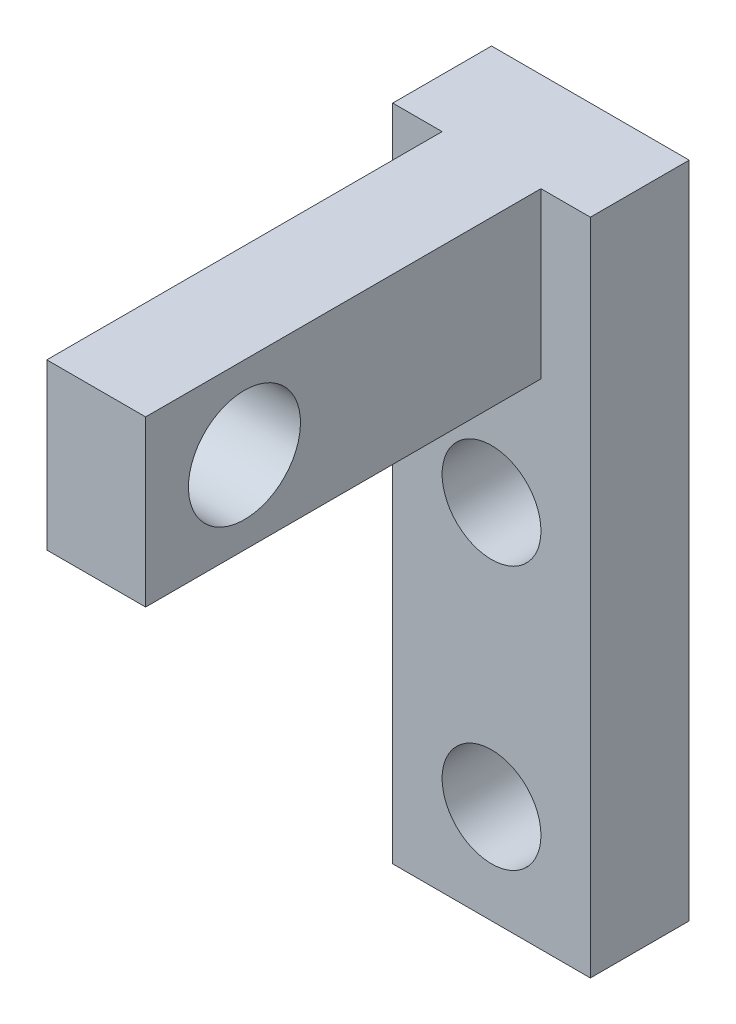
ISO-10303-21;
HEADER;
FILE_DESCRIPTION(('STEP AP214'),'2;1');
FILE_NAME('part.step','',(''),(''),'','','');
FILE_SCHEMA(('AUTOMOTIVE_DESIGN { 1 0 10303 214 1 1 1 1 }'));
ENDSEC;
DATA;
#1=APPLICATION_CONTEXT('core data for automotive mechanical design processes');
#2=APPLICATION_PROTOCOL_DEFINITION('international standard','automotive_design',2000,#1);
#3=PRODUCT_CONTEXT('',#1,'mechanical');
#4=PRODUCT('Part','Part','',(#3));
#5=PRODUCT_RELATED_PRODUCT_CATEGORY('part','',(#4));
#6=PRODUCT_DEFINITION_FORMATION('','',#4);
#7=PRODUCT_DEFINITION_CONTEXT('part definition',#1,'design');
#8=PRODUCT_DEFINITION('design','',#6,#7);
#9=PRODUCT_DEFINITION_SHAPE('','',#8);
#10=(LENGTH_UNIT() NAMED_UNIT(*) SI_UNIT(.MILLI.,.METRE.));
#11=(NAMED_UNIT(*) PLANE_ANGLE_UNIT() SI_UNIT($,.RADIAN.));
#12=(NAMED_UNIT(*) SI_UNIT($,.STERADIAN.) SOLID_ANGLE_UNIT());
#13=UNCERTAINTY_MEASURE_WITH_UNIT(LENGTH_MEASURE(1.E-05),#10,'distance_accuracy_value','');
#14=(GEOMETRIC_REPRESENTATION_CONTEXT(3) GLOBAL_UNCERTAINTY_ASSIGNED_CONTEXT((#13)) GLOBAL_UNIT_ASSIGNED_CONTEXT((#10,
#11,#12)) REPRESENTATION_CONTEXT('',''));
#15=CARTESIAN_POINT('',(0.,0.,0.));
#16=DIRECTION('',(0.,0.,1.));
#17=DIRECTION('',(1.,0.,0.));
#18=AXIS2_PLACEMENT_3D('',#15,#16,#17);
#19=CARTESIAN_POINT('',(0.,0.,3.));
#20=DIRECTION('',(0.,0.,-1.));
#21=DIRECTION('',(-1.,0.,0.));
#22=AXIS2_PLACEMENT_3D('',#19,#20,#21);
#23=PLANE('',#22);
#24=CARTESIAN_POINT('',(0.,-8.,3.));
#25=DIRECTION('',(0.,0.,1.));
#26=DIRECTION('',(1.,0.,0.));
#27=AXIS2_PLACEMENT_3D('',#24,#25,#26);
#28=CIRCLE('',#27,1.5);
#29=CARTESIAN_POINT('',(1.5,-8.,3.));
#30=VERTEX_POINT('',#29);
#31=EDGE_CURVE('E126',#30,#30,#28,.T.);
#32=ORIENTED_EDGE('',*,*,#31,.F.);
#33=EDGE_LOOP('',(#32));
#34=FACE_BOUND('',#33,.T.);
#35=CARTESIAN_POINT('',(0.,0.,3.));
#36=DIRECTION('',(0.,0.,1.));
#37=DIRECTION('',(1.,0.,0.));
#38=AXIS2_PLACEMENT_3D('',#35,#36,#37);
#39=CIRCLE('',#38,1.5);
#40=CARTESIAN_POINT('',(1.5,0.,3.));
#41=VERTEX_POINT('',#40);
#42=EDGE_CURVE('E135',#41,#41,#39,.T.);
#43=ORIENTED_EDGE('',*,*,#42,.F.);
#44=EDGE_LOOP('',(#43));
#45=FACE_BOUND('',#44,.T.);
#46=DIRECTION('',(0.,1.,0.));
#47=VECTOR('',#46,1.);
#48=CARTESIAN_POINT('',(1.5,9.,3.));
#49=LINE('',#48,#47);
#50=CARTESIAN_POINT('',(1.5,4.,3.));
#51=VERTEX_POINT('',#50);
#52=CARTESIAN_POINT('',(1.5,9.,3.));
#53=VERTEX_POINT('',#52);
#54=EDGE_CURVE('E51',#51,#53,#49,.T.);
#55=ORIENTED_EDGE('',*,*,#54,.F.);
#56=DIRECTION('',(1.,0.,0.));
#57=VECTOR('',#56,1.);
#58=CARTESIAN_POINT('',(1.5,4.,3.));
#59=LINE('',#58,#57);
#60=CARTESIAN_POINT('',(-1.5,4.,3.));
#61=VERTEX_POINT('',#60);
#62=EDGE_CURVE('E120',#61,#51,#59,.T.);
#63=ORIENTED_EDGE('',*,*,#62,.F.);
#64=DIRECTION('',(0.,-1.,0.));
#65=VECTOR('',#64,1.);
#66=CARTESIAN_POINT('',(-1.5,9.,3.));
#67=LINE('',#66,#65);
#68=CARTESIAN_POINT('',(-1.5,9.,3.));
#69=VERTEX_POINT('',#68);
#70=EDGE_CURVE('E57',#69,#61,#67,.T.);
#71=ORIENTED_EDGE('',*,*,#70,.F.);
#72=DIRECTION('',(-1.,0.,0.));
#73=VECTOR('',#72,1.);
#74=CARTESIAN_POINT('',(-3.,9.,3.));
#75=LINE('',#74,#73);
#76=CARTESIAN_POINT('',(-3.,9.,3.));
#77=VERTEX_POINT('',#76);
#78=EDGE_CURVE('E149',#69,#77,#75,.T.);
#79=ORIENTED_EDGE('',*,*,#78,.T.);
#80=DIRECTION('',(0.,-1.,0.));
#81=VECTOR('',#80,1.);
#82=CARTESIAN_POINT('',(-3.,-11.,3.));
#83=LINE('',#82,#81);
#84=CARTESIAN_POINT('',(-3.,-11.,3.));
#85=VERTEX_POINT('',#84);
#86=EDGE_CURVE('E141',#77,#85,#83,.T.);
#87=ORIENTED_EDGE('',*,*,#86,.T.);
#88=DIRECTION('',(1.,0.,0.));
#89=VECTOR('',#88,1.);
#90=CARTESIAN_POINT('',(-3.,-11.,3.));
#91=LINE('',#90,#89);
#92=CARTESIAN_POINT('',(3.,-11.,3.));
#93=VERTEX_POINT('',#92);
#94=EDGE_CURVE('E144',#85,#93,#91,.T.);
#95=ORIENTED_EDGE('',*,*,#94,.T.);
#96=DIRECTION('',(0.,1.,0.));
#97=VECTOR('',#96,1.);
#98=CARTESIAN_POINT('',(3.,-11.,3.));
#99=LINE('',#98,#97);
#100=CARTESIAN_POINT('',(3.,9.,3.));
#101=VERTEX_POINT('',#100);
#102=EDGE_CURVE('E147',#93,#101,#99,.T.);
#103=ORIENTED_EDGE('',*,*,#102,.T.);
#104=EDGE_CURVE('E150',#101,#53,#75,.T.);
#105=ORIENTED_EDGE('',*,*,#104,.T.);
#106=EDGE_LOOP('',(#55,#63,#71,#79,#87,#95,#103,#105));
#107=FACE_BOUND('',#106,.T.);
#108=ADVANCED_FACE('F35',(#34,#45,#107),#23,.F.);
#109=CARTESIAN_POINT('',(0.,0.,0.));
#110=DIRECTION('',(0.,0.,-1.));
#111=DIRECTION('',(-1.,0.,0.));
#112=AXIS2_PLACEMENT_3D('',#109,#110,#111);
#113=PLANE('',#112);
#114=CARTESIAN_POINT('',(0.,0.,0.));
#115=DIRECTION('',(0.,0.,1.));
#116=DIRECTION('',(1.,0.,0.));
#117=AXIS2_PLACEMENT_3D('',#114,#115,#116);
#118=CIRCLE('',#117,1.5);
#119=CARTESIAN_POINT('',(1.5,0.,0.));
#120=VERTEX_POINT('',#119);
#121=EDGE_CURVE('E133',#120,#120,#118,.T.);
#122=ORIENTED_EDGE('',*,*,#121,.T.);
#123=EDGE_LOOP('',(#122));
#124=FACE_BOUND('',#123,.T.);
#125=DIRECTION('',(0.,-1.,0.));
#126=VECTOR('',#125,1.);
#127=CARTESIAN_POINT('',(-3.,-11.,0.));
#128=LINE('',#127,#126);
#129=CARTESIAN_POINT('',(-3.,9.,0.));
#130=VERTEX_POINT('',#129);
#131=CARTESIAN_POINT('',(-3.,-11.,0.));
#132=VERTEX_POINT('',#131);
#133=EDGE_CURVE('E138',#130,#132,#128,.T.);
#134=ORIENTED_EDGE('',*,*,#133,.F.);
#135=DIRECTION('',(-1.,0.,0.));
#136=VECTOR('',#135,1.);
#137=CARTESIAN_POINT('',(-3.,9.,0.));
#138=LINE('',#137,#136);
#139=CARTESIAN_POINT('',(3.,9.,0.));
#140=VERTEX_POINT('',#139);
#141=EDGE_CURVE('E145',#140,#130,#138,.T.);
#142=ORIENTED_EDGE('',*,*,#141,.F.);
#143=DIRECTION('',(0.,1.,0.));
#144=VECTOR('',#143,1.);
#145=CARTESIAN_POINT('',(3.,-11.,0.));
#146=LINE('',#145,#144);
#147=CARTESIAN_POINT('',(3.,-11.,0.));
#148=VERTEX_POINT('',#147);
#149=EDGE_CURVE('E157',#148,#140,#146,.T.);
#150=ORIENTED_EDGE('',*,*,#149,.F.);
#151=DIRECTION('',(1.,0.,0.));
#152=VECTOR('',#151,1.);
#153=CARTESIAN_POINT('',(-3.,-11.,0.));
#154=LINE('',#153,#152);
#155=EDGE_CURVE('E155',#132,#148,#154,.T.);
#156=ORIENTED_EDGE('',*,*,#155,.F.);
#157=EDGE_LOOP('',(#134,#142,#150,#156));
#158=FACE_BOUND('',#157,.T.);
#159=CARTESIAN_POINT('',(0.,-8.,0.));
#160=DIRECTION('',(0.,0.,1.));
#161=DIRECTION('',(1.,0.,0.));
#162=AXIS2_PLACEMENT_3D('',#159,#160,#161);
#163=CIRCLE('',#162,1.5);
#164=CARTESIAN_POINT('',(1.5,-8.,0.));
#165=VERTEX_POINT('',#164);
#166=EDGE_CURVE('E123',#165,#165,#163,.T.);
#167=ORIENTED_EDGE('',*,*,#166,.T.);
#168=EDGE_LOOP('',(#167));
#169=FACE_BOUND('',#168,.T.);
#170=ADVANCED_FACE('F176',(#124,#158,#169),#113,.T.);
#171=CARTESIAN_POINT('',(-3.,-11.,3.));
#172=DIRECTION('',(1.,0.,0.));
#173=DIRECTION('',(0.,0.,-1.));
#174=AXIS2_PLACEMENT_3D('',#171,#172,#173);
#175=PLANE('',#174);
#176=ORIENTED_EDGE('',*,*,#133,.T.);
#177=DIRECTION('',(0.,0.,-1.));
#178=VECTOR('',#177,1.);
#179=CARTESIAN_POINT('',(-3.,-11.,3.));
#180=LINE('',#179,#178);
#181=EDGE_CURVE('E11',#85,#132,#180,.T.);
#182=ORIENTED_EDGE('',*,*,#181,.F.);
#183=ORIENTED_EDGE('',*,*,#86,.F.);
#184=DIRECTION('',(0.,0.,-1.));
#185=VECTOR('',#184,1.);
#186=CARTESIAN_POINT('',(-3.,9.,3.));
#187=LINE('',#186,#185);
#188=EDGE_CURVE('E152',#77,#130,#187,.T.);
#189=ORIENTED_EDGE('',*,*,#188,.T.);
#190=EDGE_LOOP('',(#176,#182,#183,#189));
#191=FACE_BOUND('',#190,.T.);
#192=ADVANCED_FACE('F37',(#191),#175,.F.);
#193=CARTESIAN_POINT('',(-3.,-11.,3.));
#194=DIRECTION('',(0.,1.,0.));
#195=DIRECTION('',(0.,0.,1.));
#196=AXIS2_PLACEMENT_3D('',#193,#194,#195);
#197=PLANE('',#196);
#198=ORIENTED_EDGE('',*,*,#155,.T.);
#199=DIRECTION('',(0.,0.,-1.));
#200=VECTOR('',#199,1.);
#201=CARTESIAN_POINT('',(3.,-11.,3.));
#202=LINE('',#201,#200);
#203=EDGE_CURVE('E44',#93,#148,#202,.T.);
#204=ORIENTED_EDGE('',*,*,#203,.F.);
#205=ORIENTED_EDGE('',*,*,#94,.F.);
#206=ORIENTED_EDGE('',*,*,#181,.T.);
#207=EDGE_LOOP('',(#198,#204,#205,#206));
#208=FACE_BOUND('',#207,.T.);
#209=ADVANCED_FACE('F222',(#208),#197,.F.);
#210=CARTESIAN_POINT('',(3.,-11.,3.));
#211=DIRECTION('',(-1.,0.,0.));
#212=DIRECTION('',(0.,0.,1.));
#213=AXIS2_PLACEMENT_3D('',#210,#211,#212);
#214=PLANE('',#213);
#215=ORIENTED_EDGE('',*,*,#149,.T.);
#216=DIRECTION('',(0.,0.,-1.));
#217=VECTOR('',#216,1.);
#218=CARTESIAN_POINT('',(3.,9.,3.));
#219=LINE('',#218,#217);
#220=EDGE_CURVE('E162',#101,#140,#219,.T.);
#221=ORIENTED_EDGE('',*,*,#220,.F.);
#222=ORIENTED_EDGE('',*,*,#102,.F.);
#223=ORIENTED_EDGE('',*,*,#203,.T.);
#224=EDGE_LOOP('',(#215,#221,#222,#223));
#225=FACE_BOUND('',#224,.T.);
#226=ADVANCED_FACE('F170',(#225),#214,.F.);
#227=CARTESIAN_POINT('',(-3.,9.,3.));
#228=DIRECTION('',(0.,-1.,0.));
#229=DIRECTION('',(0.,0.,-1.));
#230=AXIS2_PLACEMENT_3D('',#227,#228,#229);
#231=PLANE('',#230);
#232=ORIENTED_EDGE('',*,*,#141,.T.);
#233=ORIENTED_EDGE('',*,*,#188,.F.);
#234=ORIENTED_EDGE('',*,*,#78,.F.);
#235=DIRECTION('',(0.,0.,-1.));
#236=VECTOR('',#235,1.);
#237=CARTESIAN_POINT('',(-1.5,9.,15.));
#238=LINE('',#237,#236);
#239=CARTESIAN_POINT('',(-1.5,9.,15.));
#240=VERTEX_POINT('',#239);
#241=EDGE_CURVE('E107',#240,#69,#238,.T.);
#242=ORIENTED_EDGE('',*,*,#241,.F.);
#243=DIRECTION('',(-1.,0.,0.));
#244=VECTOR('',#243,1.);
#245=CARTESIAN_POINT('',(1.5,9.,15.));
#246=LINE('',#245,#244);
#247=CARTESIAN_POINT('',(1.5,9.,15.));
#248=VERTEX_POINT('',#247);
#249=EDGE_CURVE('E100',#248,#240,#246,.T.);
#250=ORIENTED_EDGE('',*,*,#249,.F.);
#251=DIRECTION('',(0.,0.,-1.));
#252=VECTOR('',#251,1.);
#253=CARTESIAN_POINT('',(1.5,9.,15.));
#254=LINE('',#253,#252);
#255=EDGE_CURVE('E105',#248,#53,#254,.T.);
#256=ORIENTED_EDGE('',*,*,#255,.T.);
#257=ORIENTED_EDGE('',*,*,#104,.F.);
#258=ORIENTED_EDGE('',*,*,#220,.T.);
#259=EDGE_LOOP('',(#232,#233,#234,#242,#250,#256,#257,#258));
#260=FACE_BOUND('',#259,.T.);
#261=ADVANCED_FACE('F102',(#260),#231,.F.);
#262=CARTESIAN_POINT('',(0.,0.,3.));
#263=DIRECTION('',(0.,0.,-1.));
#264=DIRECTION('',(-1.,0.,0.));
#265=AXIS2_PLACEMENT_3D('',#262,#263,#264);
#266=CYLINDRICAL_SURFACE('',#265,1.5);
#267=ORIENTED_EDGE('',*,*,#42,.T.);
#268=EDGE_LOOP('',(#267));
#269=FACE_BOUND('',#268,.T.);
#270=ORIENTED_EDGE('',*,*,#121,.F.);
#271=EDGE_LOOP('',(#270));
#272=FACE_BOUND('',#271,.T.);
#273=ADVANCED_FACE('F216',(#269,#272),#266,.F.);
#274=CARTESIAN_POINT('',(0.,-8.,3.));
#275=DIRECTION('',(0.,0.,-1.));
#276=DIRECTION('',(-1.,0.,0.));
#277=AXIS2_PLACEMENT_3D('',#274,#275,#276);
#278=CYLINDRICAL_SURFACE('',#277,1.5);
#279=ORIENTED_EDGE('',*,*,#31,.T.);
#280=EDGE_LOOP('',(#279));
#281=FACE_BOUND('',#280,.T.);
#282=ORIENTED_EDGE('',*,*,#166,.F.);
#283=EDGE_LOOP('',(#282));
#284=FACE_BOUND('',#283,.T.);
#285=ADVANCED_FACE('F263',(#281,#284),#278,.F.);
#286=CARTESIAN_POINT('',(1.5,9.,15.));
#287=DIRECTION('',(-1.,0.,0.));
#288=DIRECTION('',(0.,-1.,0.));
#289=AXIS2_PLACEMENT_3D('',#286,#287,#288);
#290=PLANE('',#289);
#291=CARTESIAN_POINT('',(1.5,6.5,12.));
#292=DIRECTION('',(1.,0.,0.));
#293=DIRECTION('',(0.,1.,0.));
#294=AXIS2_PLACEMENT_3D('',#291,#292,#293);
#295=CIRCLE('',#294,1.7);
#296=CARTESIAN_POINT('',(1.5,8.2,12.));
#297=VERTEX_POINT('',#296);
#298=EDGE_CURVE('E313',#297,#297,#295,.T.);
#299=ORIENTED_EDGE('',*,*,#298,.F.);
#300=EDGE_LOOP('',(#299));
#301=FACE_BOUND('',#300,.T.);
#302=ORIENTED_EDGE('',*,*,#54,.T.);
#303=ORIENTED_EDGE('',*,*,#255,.F.);
#304=DIRECTION('',(0.,1.,0.));
#305=VECTOR('',#304,1.);
#306=CARTESIAN_POINT('',(1.5,9.,15.));
#307=LINE('',#306,#305);
#308=CARTESIAN_POINT('',(1.5,4.,15.));
#309=VERTEX_POINT('',#308);
#310=EDGE_CURVE('E111',#309,#248,#307,.T.);
#311=ORIENTED_EDGE('',*,*,#310,.F.);
#312=DIRECTION('',(0.,0.,-1.));
#313=VECTOR('',#312,1.);
#314=CARTESIAN_POINT('',(1.5,4.,15.));
#315=LINE('',#314,#313);
#316=EDGE_CURVE('E187',#309,#51,#315,.T.);
#317=ORIENTED_EDGE('',*,*,#316,.T.);
#318=EDGE_LOOP('',(#302,#303,#311,#317));
#319=FACE_BOUND('',#318,.T.);
#320=ADVANCED_FACE('F122',(#301,#319),#290,.F.);
#321=CARTESIAN_POINT('',(-1.5,9.,15.));
#322=DIRECTION('',(1.,0.,0.));
#323=DIRECTION('',(0.,1.,0.));
#324=AXIS2_PLACEMENT_3D('',#321,#322,#323);
#325=PLANE('',#324);
#326=CARTESIAN_POINT('',(-1.5,6.5,12.));
#327=DIRECTION('',(1.,0.,0.));
#328=DIRECTION('',(0.,1.,0.));
#329=AXIS2_PLACEMENT_3D('',#326,#327,#328);
#330=CIRCLE('',#329,1.7);
#331=CARTESIAN_POINT('',(-1.5,8.2,12.));
#332=VERTEX_POINT('',#331);
#333=EDGE_CURVE('E39',#332,#332,#330,.T.);
#334=ORIENTED_EDGE('',*,*,#333,.T.);
#335=EDGE_LOOP('',(#334));
#336=FACE_BOUND('',#335,.T.);
#337=ORIENTED_EDGE('',*,*,#70,.T.);
#338=DIRECTION('',(0.,0.,-1.));
#339=VECTOR('',#338,1.);
#340=CARTESIAN_POINT('',(-1.5,4.,15.));
#341=LINE('',#340,#339);
#342=CARTESIAN_POINT('',(-1.5,4.,15.));
#343=VERTEX_POINT('',#342);
#344=EDGE_CURVE('E128',#343,#61,#341,.T.);
#345=ORIENTED_EDGE('',*,*,#344,.F.);
#346=DIRECTION('',(0.,-1.,0.));
#347=VECTOR('',#346,1.);
#348=CARTESIAN_POINT('',(-1.5,9.,15.));
#349=LINE('',#348,#347);
#350=EDGE_CURVE('E110',#240,#343,#349,.T.);
#351=ORIENTED_EDGE('',*,*,#350,.F.);
#352=ORIENTED_EDGE('',*,*,#241,.T.);
#353=EDGE_LOOP('',(#337,#345,#351,#352));
#354=FACE_BOUND('',#353,.T.);
#355=ADVANCED_FACE('F183',(#336,#354),#325,.F.);
#356=CARTESIAN_POINT('',(1.5,4.,15.));
#357=DIRECTION('',(0.,1.,0.));
#358=DIRECTION('',(0.,0.,1.));
#359=AXIS2_PLACEMENT_3D('',#356,#357,#358);
#360=PLANE('',#359);
#361=ORIENTED_EDGE('',*,*,#62,.T.);
#362=ORIENTED_EDGE('',*,*,#316,.F.);
#363=DIRECTION('',(1.,0.,0.));
#364=VECTOR('',#363,1.);
#365=CARTESIAN_POINT('',(1.5,4.,15.));
#366=LINE('',#365,#364);
#367=EDGE_CURVE('E116',#343,#309,#366,.T.);
#368=ORIENTED_EDGE('',*,*,#367,.F.);
#369=ORIENTED_EDGE('',*,*,#344,.T.);
#370=EDGE_LOOP('',(#361,#362,#368,#369));
#371=FACE_BOUND('',#370,.T.);
#372=ADVANCED_FACE('F194',(#371),#360,.F.);
#373=CARTESIAN_POINT('',(0.,0.,15.));
#374=DIRECTION('',(0.,0.,-1.));
#375=DIRECTION('',(-1.,0.,0.));
#376=AXIS2_PLACEMENT_3D('',#373,#374,#375);
#377=PLANE('',#376);
#378=ORIENTED_EDGE('',*,*,#310,.T.);
#379=ORIENTED_EDGE('',*,*,#249,.T.);
#380=ORIENTED_EDGE('',*,*,#350,.T.);
#381=ORIENTED_EDGE('',*,*,#367,.T.);
#382=EDGE_LOOP('',(#378,#379,#380,#381));
#383=FACE_BOUND('',#382,.T.);
#384=ADVANCED_FACE('F114',(#383),#377,.F.);
#385=CARTESIAN_POINT('',(-3.,6.5,12.));
#386=DIRECTION('',(1.,0.,0.));
#387=DIRECTION('',(0.,1.,0.));
#388=AXIS2_PLACEMENT_3D('',#385,#386,#387);
#389=CYLINDRICAL_SURFACE('',#388,1.7);
#390=ORIENTED_EDGE('',*,*,#298,.T.);
#391=EDGE_LOOP('',(#390));
#392=FACE_BOUND('',#391,.T.);
#393=ORIENTED_EDGE('',*,*,#333,.F.);
#394=EDGE_LOOP('',(#393));
#395=FACE_BOUND('',#394,.T.);
#396=ADVANCED_FACE('F201',(#392,#395),#389,.F.);
#397=CLOSED_SHELL('',(#108,#170,#192,#209,#226,#261,#273,#285,#320,#355,#372,#384,#396));
#398=MANIFOLD_SOLID_BREP('B2',#397);
#399=ADVANCED_BREP_SHAPE_REPRESENTATION('',(#18,#398),#14);
#400=SHAPE_DEFINITION_REPRESENTATION(#9,#399);
ENDSEC;
END-ISO-10303-21;
